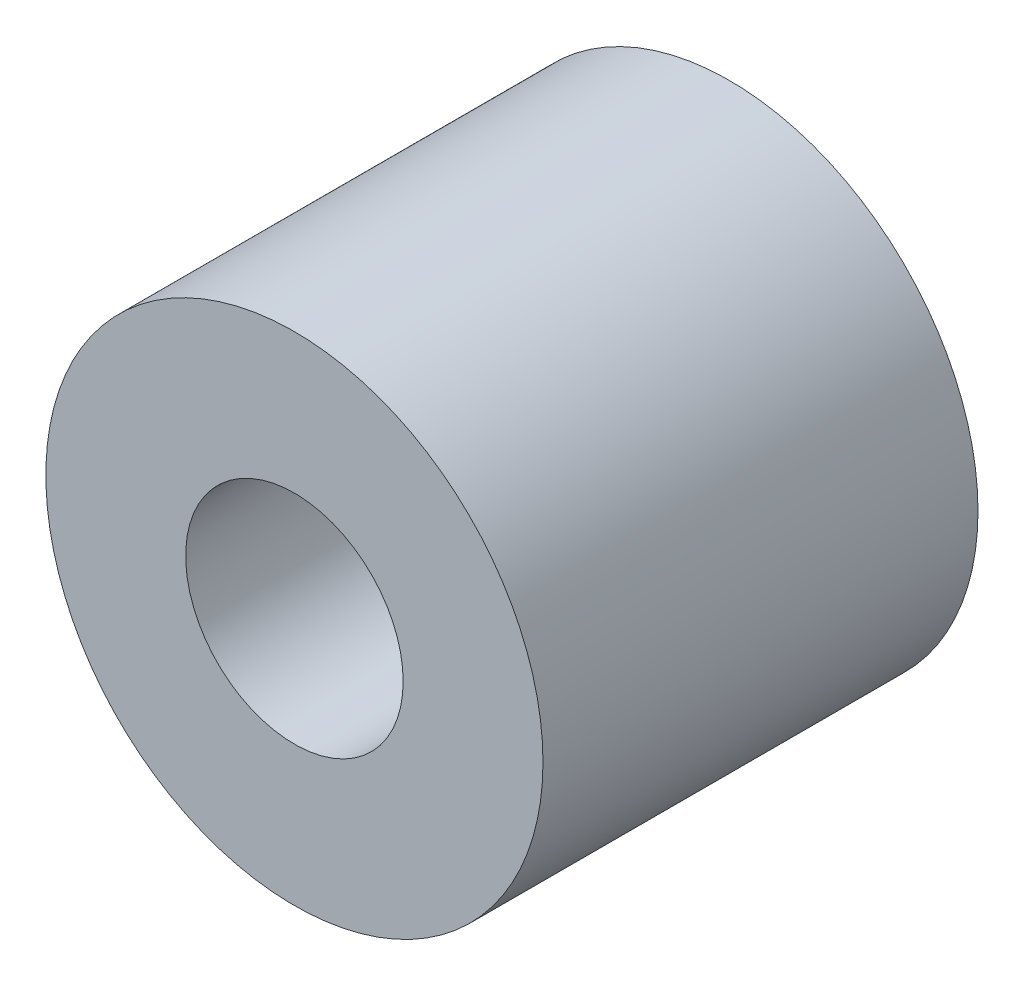
ISO-10303-21;
HEADER;
FILE_DESCRIPTION(('STEP AP214'),'2;1');
FILE_NAME('part.step','',(''),(''),'','','');
FILE_SCHEMA(('AUTOMOTIVE_DESIGN { 1 0 10303 214 1 1 1 1 }'));
ENDSEC;
DATA;
#1=APPLICATION_CONTEXT('core data for automotive mechanical design processes');
#2=APPLICATION_PROTOCOL_DEFINITION('international standard','automotive_design',2000,#1);
#3=PRODUCT_CONTEXT('',#1,'mechanical');
#4=PRODUCT('Part','Part','',(#3));
#5=PRODUCT_RELATED_PRODUCT_CATEGORY('part','',(#4));
#6=PRODUCT_DEFINITION_FORMATION('','',#4);
#7=PRODUCT_DEFINITION_CONTEXT('part definition',#1,'design');
#8=PRODUCT_DEFINITION('design','',#6,#7);
#9=PRODUCT_DEFINITION_SHAPE('','',#8);
#10=(LENGTH_UNIT() NAMED_UNIT(*) SI_UNIT(.MILLI.,.METRE.));
#11=(NAMED_UNIT(*) PLANE_ANGLE_UNIT() SI_UNIT($,.RADIAN.));
#12=(NAMED_UNIT(*) SI_UNIT($,.STERADIAN.) SOLID_ANGLE_UNIT());
#13=UNCERTAINTY_MEASURE_WITH_UNIT(LENGTH_MEASURE(1.E-05),#10,'distance_accuracy_value','');
#14=(GEOMETRIC_REPRESENTATION_CONTEXT(3) GLOBAL_UNCERTAINTY_ASSIGNED_CONTEXT((#13)) GLOBAL_UNIT_ASSIGNED_CONTEXT((#10,
#11,#12)) REPRESENTATION_CONTEXT('',''));
#15=CARTESIAN_POINT('',(0.,0.,0.));
#16=DIRECTION('',(0.,0.,1.));
#17=DIRECTION('',(1.,0.,0.));
#18=AXIS2_PLACEMENT_3D('',#15,#16,#17);
#19=CARTESIAN_POINT('',(0.,0.,7.));
#20=DIRECTION('',(0.,0.,1.));
#21=DIRECTION('',(1.,0.,0.));
#22=AXIS2_PLACEMENT_3D('',#19,#20,#21);
#23=PLANE('',#22);
#24=CARTESIAN_POINT('',(0.,0.,7.));
#25=DIRECTION('',(0.,0.,1.));
#26=DIRECTION('',(1.,0.,0.));
#27=AXIS2_PLACEMENT_3D('',#24,#25,#26);
#28=CIRCLE('',#27,4.);
#29=CARTESIAN_POINT('',(4.,0.,7.));
#30=VERTEX_POINT('',#29);
#31=EDGE_CURVE('E10',#30,#30,#28,.T.);
#32=ORIENTED_EDGE('',*,*,#31,.T.);
#33=EDGE_LOOP('',(#32));
#34=FACE_BOUND('',#33,.T.);
#35=CARTESIAN_POINT('',(0.,0.,7.));
#36=DIRECTION('',(0.,0.,1.));
#37=DIRECTION('',(1.,0.,0.));
#38=AXIS2_PLACEMENT_3D('',#35,#36,#37);
#39=CIRCLE('',#38,1.75);
#40=CARTESIAN_POINT('',(1.75,0.,7.));
#41=VERTEX_POINT('',#40);
#42=EDGE_CURVE('E50',#41,#41,#39,.T.);
#43=ORIENTED_EDGE('',*,*,#42,.F.);
#44=EDGE_LOOP('',(#43));
#45=FACE_BOUND('',#44,.T.);
#46=ADVANCED_FACE('F37',(#34,#45),#23,.T.);
#47=CARTESIAN_POINT('',(0.,0.,0.));
#48=DIRECTION('',(0.,0.,1.));
#49=DIRECTION('',(1.,0.,0.));
#50=AXIS2_PLACEMENT_3D('',#47,#48,#49);
#51=PLANE('',#50);
#52=CARTESIAN_POINT('',(0.,0.,0.));
#53=DIRECTION('',(0.,0.,1.));
#54=DIRECTION('',(1.,0.,0.));
#55=AXIS2_PLACEMENT_3D('',#52,#53,#54);
#56=CIRCLE('',#55,4.);
#57=CARTESIAN_POINT('',(4.,0.,0.));
#58=VERTEX_POINT('',#57);
#59=EDGE_CURVE('E41',#58,#58,#56,.T.);
#60=ORIENTED_EDGE('',*,*,#59,.F.);
#61=EDGE_LOOP('',(#60));
#62=FACE_BOUND('',#61,.T.);
#63=CARTESIAN_POINT('',(0.,0.,0.));
#64=DIRECTION('',(0.,0.,1.));
#65=DIRECTION('',(1.,0.,0.));
#66=AXIS2_PLACEMENT_3D('',#63,#64,#65);
#67=CIRCLE('',#66,1.75);
#68=CARTESIAN_POINT('',(1.75,0.,0.));
#69=VERTEX_POINT('',#68);
#70=EDGE_CURVE('E52',#69,#69,#67,.T.);
#71=ORIENTED_EDGE('',*,*,#70,.T.);
#72=EDGE_LOOP('',(#71));
#73=FACE_BOUND('',#72,.T.);
#74=ADVANCED_FACE('F64',(#62,#73),#51,.F.);
#75=CARTESIAN_POINT('',(0.,0.,7.));
#76=DIRECTION('',(0.,0.,-1.));
#77=DIRECTION('',(-1.,0.,0.));
#78=AXIS2_PLACEMENT_3D('',#75,#76,#77);
#79=CYLINDRICAL_SURFACE('',#78,4.);
#80=ORIENTED_EDGE('',*,*,#31,.F.);
#81=EDGE_LOOP('',(#80));
#82=FACE_BOUND('',#81,.T.);
#83=ORIENTED_EDGE('',*,*,#59,.T.);
#84=EDGE_LOOP('',(#83));
#85=FACE_BOUND('',#84,.T.);
#86=ADVANCED_FACE('F39',(#82,#85),#79,.T.);
#87=CARTESIAN_POINT('',(0.,0.,7.));
#88=DIRECTION('',(0.,0.,-1.));
#89=DIRECTION('',(-1.,0.,0.));
#90=AXIS2_PLACEMENT_3D('',#87,#88,#89);
#91=CYLINDRICAL_SURFACE('',#90,1.75);
#92=ORIENTED_EDGE('',*,*,#42,.T.);
#93=EDGE_LOOP('',(#92));
#94=FACE_BOUND('',#93,.T.);
#95=ORIENTED_EDGE('',*,*,#70,.F.);
#96=EDGE_LOOP('',(#95));
#97=FACE_BOUND('',#96,.T.);
#98=ADVANCED_FACE('F60',(#94,#97),#91,.F.);
#99=CLOSED_SHELL('',(#46,#74,#86,#98));
#100=MANIFOLD_SOLID_BREP('B2',#99);
#101=ADVANCED_BREP_SHAPE_REPRESENTATION('',(#18,#100),#14);
#102=SHAPE_DEFINITION_REPRESENTATION(#9,#101);
ENDSEC;
END-ISO-10303-21;
